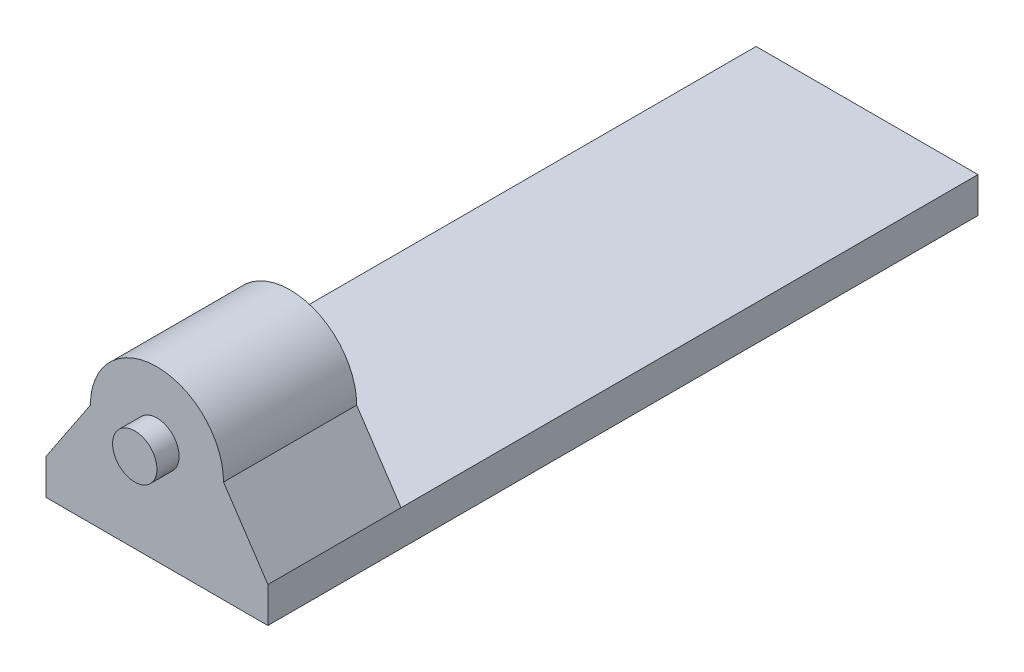
ISO-10303-21;
HEADER;
FILE_DESCRIPTION(('STEP AP214'),'2;1');
FILE_NAME('part.step','',(''),(''),'','','');
FILE_SCHEMA(('AUTOMOTIVE_DESIGN { 1 0 10303 214 1 1 1 1 }'));
ENDSEC;
DATA;
#1=APPLICATION_CONTEXT('core data for automotive mechanical design processes');
#2=APPLICATION_PROTOCOL_DEFINITION('international standard','automotive_design',2000,#1);
#3=PRODUCT_CONTEXT('',#1,'mechanical');
#4=PRODUCT('Part','Part','',(#3));
#5=PRODUCT_RELATED_PRODUCT_CATEGORY('part','',(#4));
#6=PRODUCT_DEFINITION_FORMATION('','',#4);
#7=PRODUCT_DEFINITION_CONTEXT('part definition',#1,'design');
#8=PRODUCT_DEFINITION('design','',#6,#7);
#9=PRODUCT_DEFINITION_SHAPE('','',#8);
#10=(LENGTH_UNIT() NAMED_UNIT(*) SI_UNIT(.MILLI.,.METRE.));
#11=(NAMED_UNIT(*) PLANE_ANGLE_UNIT() SI_UNIT($,.RADIAN.));
#12=(NAMED_UNIT(*) SI_UNIT($,.STERADIAN.) SOLID_ANGLE_UNIT());
#13=UNCERTAINTY_MEASURE_WITH_UNIT(LENGTH_MEASURE(1.E-05),#10,'distance_accuracy_value','');
#14=(GEOMETRIC_REPRESENTATION_CONTEXT(3) GLOBAL_UNCERTAINTY_ASSIGNED_CONTEXT((#13)) GLOBAL_UNIT_ASSIGNED_CONTEXT((#10,
#11,#12)) REPRESENTATION_CONTEXT('',''));
#15=CARTESIAN_POINT('',(0.,0.,0.));
#16=DIRECTION('',(0.,0.,1.));
#17=DIRECTION('',(1.,0.,0.));
#18=AXIS2_PLACEMENT_3D('',#15,#16,#17);
#19=CARTESIAN_POINT('',(-25.,4.,0.));
#20=DIRECTION('',(0.,1.,0.));
#21=DIRECTION('',(0.,0.,1.));
#22=AXIS2_PLACEMENT_3D('',#19,#20,#21);
#23=PLANE('',#22);
#24=DIRECTION('',(0.,0.,1.));
#25=VECTOR('',#24,1.);
#26=CARTESIAN_POINT('',(-25.,4.,0.));
#27=LINE('',#26,#25);
#28=CARTESIAN_POINT('',(-25.,4.,0.));
#29=VERTEX_POINT('',#28);
#30=CARTESIAN_POINT('',(-25.,4.,130.));
#31=VERTEX_POINT('',#30);
#32=EDGE_CURVE('E127',#29,#31,#27,.T.);
#33=ORIENTED_EDGE('',*,*,#32,.T.);
#34=DIRECTION('',(1.,0.,0.));
#35=VECTOR('',#34,1.);
#36=CARTESIAN_POINT('',(25.,4.,130.));
#37=LINE('',#36,#35);
#38=CARTESIAN_POINT('',(25.,4.,130.));
#39=VERTEX_POINT('',#38);
#40=EDGE_CURVE('E104',#31,#39,#37,.T.);
#41=ORIENTED_EDGE('',*,*,#40,.T.);
#42=DIRECTION('',(0.,0.,1.));
#43=VECTOR('',#42,1.);
#44=CARTESIAN_POINT('',(25.,4.,0.));
#45=LINE('',#44,#43);
#46=CARTESIAN_POINT('',(25.,4.,0.));
#47=VERTEX_POINT('',#46);
#48=EDGE_CURVE('E11',#47,#39,#45,.T.);
#49=ORIENTED_EDGE('',*,*,#48,.F.);
#50=DIRECTION('',(-1.,0.,0.));
#51=VECTOR('',#50,1.);
#52=CARTESIAN_POINT('',(-25.,4.,0.));
#53=LINE('',#52,#51);
#54=EDGE_CURVE('E40',#47,#29,#53,.T.);
#55=ORIENTED_EDGE('',*,*,#54,.T.);
#56=EDGE_LOOP('',(#33,#41,#49,#55));
#57=FACE_BOUND('',#56,.T.);
#58=ADVANCED_FACE('F36',(#57),#23,.T.);
#59=CARTESIAN_POINT('',(0.,0.,0.));
#60=DIRECTION('',(0.,0.,1.));
#61=DIRECTION('',(1.,0.,0.));
#62=AXIS2_PLACEMENT_3D('',#59,#60,#61);
#63=PLANE('',#62);
#64=DIRECTION('',(0.,-1.,0.));
#65=VECTOR('',#64,1.);
#66=CARTESIAN_POINT('',(-25.,4.,0.));
#67=LINE('',#66,#65);
#68=CARTESIAN_POINT('',(-25.,-4.,0.));
#69=VERTEX_POINT('',#68);
#70=EDGE_CURVE('E138',#29,#69,#67,.T.);
#71=ORIENTED_EDGE('',*,*,#70,.F.);
#72=ORIENTED_EDGE('',*,*,#54,.F.);
#73=DIRECTION('',(0.,1.,0.));
#74=VECTOR('',#73,1.);
#75=CARTESIAN_POINT('',(25.,4.,0.));
#76=LINE('',#75,#74);
#77=CARTESIAN_POINT('',(25.,-4.,0.));
#78=VERTEX_POINT('',#77);
#79=EDGE_CURVE('E75',#78,#47,#76,.T.);
#80=ORIENTED_EDGE('',*,*,#79,.F.);
#81=DIRECTION('',(1.,0.,0.));
#82=VECTOR('',#81,1.);
#83=CARTESIAN_POINT('',(-25.,-4.,0.));
#84=LINE('',#83,#82);
#85=EDGE_CURVE('E79',#69,#78,#84,.T.);
#86=ORIENTED_EDGE('',*,*,#85,.F.);
#87=EDGE_LOOP('',(#71,#72,#80,#86));
#88=FACE_BOUND('',#87,.T.);
#89=ADVANCED_FACE('F38',(#88),#63,.F.);
#90=CARTESIAN_POINT('',(0.,0.,160.));
#91=DIRECTION('',(0.,0.,1.));
#92=DIRECTION('',(1.,0.,0.));
#93=AXIS2_PLACEMENT_3D('',#90,#91,#92);
#94=PLANE('',#93);
#95=CARTESIAN_POINT('',(0.,19.,160.));
#96=DIRECTION('',(0.,0.,1.));
#97=DIRECTION('',(1.,0.,0.));
#98=AXIS2_PLACEMENT_3D('',#95,#96,#97);
#99=CIRCLE('',#98,5.);
#100=CARTESIAN_POINT('',(5.,19.,160.));
#101=VERTEX_POINT('',#100);
#102=EDGE_CURVE('E169',#101,#101,#99,.T.);
#103=ORIENTED_EDGE('',*,*,#102,.F.);
#104=EDGE_LOOP('',(#103));
#105=FACE_BOUND('',#104,.T.);
#106=DIRECTION('',(0.,-1.,0.));
#107=VECTOR('',#106,1.);
#108=CARTESIAN_POINT('',(-25.,4.,160.));
#109=LINE('',#108,#107);
#110=CARTESIAN_POINT('',(-25.,4.,160.));
#111=VERTEX_POINT('',#110);
#112=CARTESIAN_POINT('',(-25.,-4.,160.));
#113=VERTEX_POINT('',#112);
#114=EDGE_CURVE('E128',#111,#113,#109,.T.);
#115=ORIENTED_EDGE('',*,*,#114,.T.);
#116=DIRECTION('',(1.,0.,0.));
#117=VECTOR('',#116,1.);
#118=CARTESIAN_POINT('',(-25.,-4.,160.));
#119=LINE('',#118,#117);
#120=CARTESIAN_POINT('',(25.,-4.,160.));
#121=VERTEX_POINT('',#120);
#122=EDGE_CURVE('E61',#113,#121,#119,.T.);
#123=ORIENTED_EDGE('',*,*,#122,.T.);
#124=DIRECTION('',(0.,1.,0.));
#125=VECTOR('',#124,1.);
#126=CARTESIAN_POINT('',(25.,4.,160.));
#127=LINE('',#126,#125);
#128=CARTESIAN_POINT('',(25.,4.,160.));
#129=VERTEX_POINT('',#128);
#130=EDGE_CURVE('E45',#121,#129,#127,.T.);
#131=ORIENTED_EDGE('',*,*,#130,.T.);
#132=DIRECTION('',(-0.554700196225229,0.832050294337843,0.));
#133=VECTOR('',#132,1.);
#134=CARTESIAN_POINT('',(15.,19.,160.));
#135=LINE('',#134,#133);
#136=CARTESIAN_POINT('',(15.,19.,160.));
#137=VERTEX_POINT('',#136);
#138=EDGE_CURVE('E147',#129,#137,#135,.T.);
#139=ORIENTED_EDGE('',*,*,#138,.T.);
#140=CARTESIAN_POINT('',(0.,19.,160.));
#141=DIRECTION('',(0.,0.,1.));
#142=DIRECTION('',(1.,0.,0.));
#143=AXIS2_PLACEMENT_3D('',#140,#141,#142);
#144=CIRCLE('',#143,15.);
#145=CARTESIAN_POINT('',(-15.,19.,160.));
#146=VERTEX_POINT('',#145);
#147=EDGE_CURVE('E120',#137,#146,#144,.T.);
#148=ORIENTED_EDGE('',*,*,#147,.T.);
#149=DIRECTION('',(-0.554700196225229,-0.832050294337843,0.));
#150=VECTOR('',#149,1.);
#151=CARTESIAN_POINT('',(-25.,4.,160.));
#152=LINE('',#151,#150);
#153=EDGE_CURVE('E164',#146,#111,#152,.T.);
#154=ORIENTED_EDGE('',*,*,#153,.T.);
#155=EDGE_LOOP('',(#115,#123,#131,#139,#148,#154));
#156=FACE_BOUND('',#155,.T.);
#157=ADVANCED_FACE('F145',(#105,#156),#94,.T.);
#158=CARTESIAN_POINT('',(-25.,4.,0.));
#159=DIRECTION('',(-1.,0.,0.));
#160=DIRECTION('',(0.,0.,1.));
#161=AXIS2_PLACEMENT_3D('',#158,#159,#160);
#162=PLANE('',#161);
#163=DIRECTION('',(0.,0.,1.));
#164=VECTOR('',#163,1.);
#165=CARTESIAN_POINT('',(-25.,-4.,0.));
#166=LINE('',#165,#164);
#167=EDGE_CURVE('E133',#69,#113,#166,.T.);
#168=ORIENTED_EDGE('',*,*,#167,.T.);
#169=ORIENTED_EDGE('',*,*,#114,.F.);
#170=DIRECTION('',(0.,0.,1.));
#171=VECTOR('',#170,1.);
#172=CARTESIAN_POINT('',(-25.,4.,130.));
#173=LINE('',#172,#171);
#174=EDGE_CURVE('E117',#31,#111,#173,.T.);
#175=ORIENTED_EDGE('',*,*,#174,.F.);
#176=ORIENTED_EDGE('',*,*,#32,.F.);
#177=ORIENTED_EDGE('',*,*,#70,.T.);
#178=EDGE_LOOP('',(#168,#169,#175,#176,#177));
#179=FACE_BOUND('',#178,.T.);
#180=ADVANCED_FACE('F126',(#179),#162,.T.);
#181=CARTESIAN_POINT('',(-25.,-4.,0.));
#182=DIRECTION('',(0.,-1.,0.));
#183=DIRECTION('',(1.,0.,0.));
#184=AXIS2_PLACEMENT_3D('',#181,#182,#183);
#185=PLANE('',#184);
#186=DIRECTION('',(0.,0.,1.));
#187=VECTOR('',#186,1.);
#188=CARTESIAN_POINT('',(25.,-4.,0.));
#189=LINE('',#188,#187);
#190=EDGE_CURVE('E140',#78,#121,#189,.T.);
#191=ORIENTED_EDGE('',*,*,#190,.T.);
#192=ORIENTED_EDGE('',*,*,#122,.F.);
#193=ORIENTED_EDGE('',*,*,#167,.F.);
#194=ORIENTED_EDGE('',*,*,#85,.T.);
#195=EDGE_LOOP('',(#191,#192,#193,#194));
#196=FACE_BOUND('',#195,.T.);
#197=ADVANCED_FACE('F154',(#196),#185,.T.);
#198=CARTESIAN_POINT('',(25.,4.,0.));
#199=DIRECTION('',(1.,0.,0.));
#200=DIRECTION('',(0.,0.,-1.));
#201=AXIS2_PLACEMENT_3D('',#198,#199,#200);
#202=PLANE('',#201);
#203=ORIENTED_EDGE('',*,*,#48,.T.);
#204=DIRECTION('',(0.,0.,1.));
#205=VECTOR('',#204,1.);
#206=CARTESIAN_POINT('',(25.,4.,130.));
#207=LINE('',#206,#205);
#208=EDGE_CURVE('E129',#39,#129,#207,.T.);
#209=ORIENTED_EDGE('',*,*,#208,.T.);
#210=ORIENTED_EDGE('',*,*,#130,.F.);
#211=ORIENTED_EDGE('',*,*,#190,.F.);
#212=ORIENTED_EDGE('',*,*,#79,.T.);
#213=EDGE_LOOP('',(#203,#209,#210,#211,#212));
#214=FACE_BOUND('',#213,.T.);
#215=ADVANCED_FACE('F152',(#214),#202,.T.);
#216=CARTESIAN_POINT('',(-25.,4.,130.));
#217=DIRECTION('',(-0.832050294337843,0.554700196225229,0.));
#218=DIRECTION('',(-0.554700196225229,-0.832050294337844,0.));
#219=AXIS2_PLACEMENT_3D('',#216,#217,#218);
#220=PLANE('',#219);
#221=ORIENTED_EDGE('',*,*,#153,.F.);
#222=DIRECTION('',(0.,0.,1.));
#223=VECTOR('',#222,1.);
#224=CARTESIAN_POINT('',(-15.,19.,130.));
#225=LINE('',#224,#223);
#226=CARTESIAN_POINT('',(-15.,19.,130.));
#227=VERTEX_POINT('',#226);
#228=EDGE_CURVE('E119',#227,#146,#225,.T.);
#229=ORIENTED_EDGE('',*,*,#228,.F.);
#230=DIRECTION('',(-0.554700196225229,-0.832050294337843,0.));
#231=VECTOR('',#230,1.);
#232=CARTESIAN_POINT('',(-25.,4.,130.));
#233=LINE('',#232,#231);
#234=EDGE_CURVE('E107',#227,#31,#233,.T.);
#235=ORIENTED_EDGE('',*,*,#234,.T.);
#236=ORIENTED_EDGE('',*,*,#174,.T.);
#237=EDGE_LOOP('',(#221,#229,#235,#236));
#238=FACE_BOUND('',#237,.T.);
#239=ADVANCED_FACE('F116',(#238),#220,.T.);
#240=CARTESIAN_POINT('',(0.,19.,130.));
#241=DIRECTION('',(0.,0.,1.));
#242=DIRECTION('',(1.,0.,0.));
#243=AXIS2_PLACEMENT_3D('',#240,#241,#242);
#244=CYLINDRICAL_SURFACE('',#243,15.);
#245=ORIENTED_EDGE('',*,*,#147,.F.);
#246=DIRECTION('',(0.,0.,1.));
#247=VECTOR('',#246,1.);
#248=CARTESIAN_POINT('',(15.,19.,130.));
#249=LINE('',#248,#247);
#250=CARTESIAN_POINT('',(15.,19.,130.));
#251=VERTEX_POINT('',#250);
#252=EDGE_CURVE('E157',#251,#137,#249,.T.);
#253=ORIENTED_EDGE('',*,*,#252,.F.);
#254=CARTESIAN_POINT('',(0.,19.,130.));
#255=DIRECTION('',(0.,0.,1.));
#256=DIRECTION('',(1.,0.,0.));
#257=AXIS2_PLACEMENT_3D('',#254,#255,#256);
#258=CIRCLE('',#257,15.);
#259=EDGE_CURVE('E130',#251,#227,#258,.T.);
#260=ORIENTED_EDGE('',*,*,#259,.T.);
#261=ORIENTED_EDGE('',*,*,#228,.T.);
#262=EDGE_LOOP('',(#245,#253,#260,#261));
#263=FACE_BOUND('',#262,.T.);
#264=ADVANCED_FACE('F199',(#263),#244,.T.);
#265=CARTESIAN_POINT('',(15.,19.,130.));
#266=DIRECTION('',(0.832050294337843,0.554700196225229,0.));
#267=DIRECTION('',(-0.554700196225229,0.832050294337844,0.));
#268=AXIS2_PLACEMENT_3D('',#265,#266,#267);
#269=PLANE('',#268);
#270=ORIENTED_EDGE('',*,*,#138,.F.);
#271=ORIENTED_EDGE('',*,*,#208,.F.);
#272=DIRECTION('',(-0.554700196225229,0.832050294337843,0.));
#273=VECTOR('',#272,1.);
#274=CARTESIAN_POINT('',(15.,19.,130.));
#275=LINE('',#274,#273);
#276=EDGE_CURVE('E52',#39,#251,#275,.T.);
#277=ORIENTED_EDGE('',*,*,#276,.T.);
#278=ORIENTED_EDGE('',*,*,#252,.T.);
#279=EDGE_LOOP('',(#270,#271,#277,#278));
#280=FACE_BOUND('',#279,.T.);
#281=ADVANCED_FACE('F203',(#280),#269,.T.);
#282=CARTESIAN_POINT('',(0.,19.,130.));
#283=DIRECTION('',(0.,0.,1.));
#284=DIRECTION('',(1.,0.,0.));
#285=AXIS2_PLACEMENT_3D('',#282,#283,#284);
#286=PLANE('',#285);
#287=ORIENTED_EDGE('',*,*,#234,.F.);
#288=ORIENTED_EDGE('',*,*,#259,.F.);
#289=ORIENTED_EDGE('',*,*,#276,.F.);
#290=ORIENTED_EDGE('',*,*,#40,.F.);
#291=EDGE_LOOP('',(#287,#288,#289,#290));
#292=FACE_BOUND('',#291,.T.);
#293=ADVANCED_FACE('F106',(#292),#286,.F.);
#294=CARTESIAN_POINT('',(0.,19.,165.));
#295=DIRECTION('',(0.,0.,-1.));
#296=DIRECTION('',(-1.,0.,0.));
#297=AXIS2_PLACEMENT_3D('',#294,#295,#296);
#298=CYLINDRICAL_SURFACE('',#297,5.);
#299=CARTESIAN_POINT('',(0.,19.,165.));
#300=DIRECTION('',(0.,0.,1.));
#301=DIRECTION('',(1.,0.,0.));
#302=AXIS2_PLACEMENT_3D('',#299,#300,#301);
#303=CIRCLE('',#302,5.);
#304=CARTESIAN_POINT('',(5.,19.,165.));
#305=VERTEX_POINT('',#304);
#306=EDGE_CURVE('E166',#305,#305,#303,.T.);
#307=ORIENTED_EDGE('',*,*,#306,.F.);
#308=EDGE_LOOP('',(#307));
#309=FACE_BOUND('',#308,.T.);
#310=ORIENTED_EDGE('',*,*,#102,.T.);
#311=EDGE_LOOP('',(#310));
#312=FACE_BOUND('',#311,.T.);
#313=ADVANCED_FACE('F177',(#309,#312),#298,.T.);
#314=CARTESIAN_POINT('',(0.,19.,165.));
#315=DIRECTION('',(0.,0.,1.));
#316=DIRECTION('',(1.,0.,0.));
#317=AXIS2_PLACEMENT_3D('',#314,#315,#316);
#318=PLANE('',#317);
#319=ORIENTED_EDGE('',*,*,#306,.T.);
#320=EDGE_LOOP('',(#319));
#321=FACE_BOUND('',#320,.T.);
#322=ADVANCED_FACE('F175',(#321),#318,.T.);
#323=CLOSED_SHELL('',(#58,#89,#157,#180,#197,#215,#239,#264,#281,#293,#313,#322));
#324=MANIFOLD_SOLID_BREP('B2',#323);
#325=ADVANCED_BREP_SHAPE_REPRESENTATION('',(#18,#324),#14);
#326=SHAPE_DEFINITION_REPRESENTATION(#9,#325);
ENDSEC;
END-ISO-10303-21;
